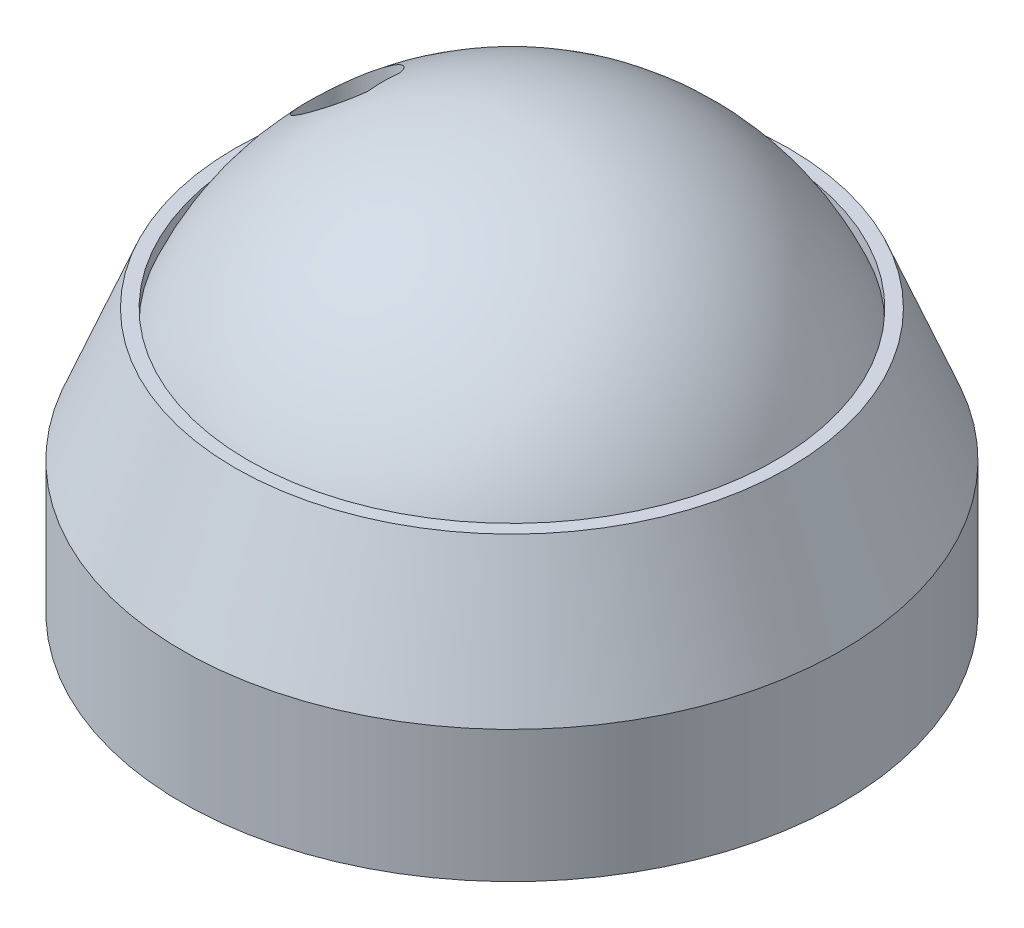
ISO-10303-21;
HEADER;
FILE_DESCRIPTION(('STEP AP214'),'2;1');
FILE_NAME('part.step','',(''),(''),'','','');
FILE_SCHEMA(('AUTOMOTIVE_DESIGN { 1 0 10303 214 1 1 1 1 }'));
ENDSEC;
DATA;
#1=APPLICATION_CONTEXT('core data for automotive mechanical design processes');
#2=APPLICATION_PROTOCOL_DEFINITION('international standard','automotive_design',2000,#1);
#3=PRODUCT_CONTEXT('',#1,'mechanical');
#4=PRODUCT('Part','Part','',(#3));
#5=PRODUCT_RELATED_PRODUCT_CATEGORY('part','',(#4));
#6=PRODUCT_DEFINITION_FORMATION('','',#4);
#7=PRODUCT_DEFINITION_CONTEXT('part definition',#1,'design');
#8=PRODUCT_DEFINITION('design','',#6,#7);
#9=PRODUCT_DEFINITION_SHAPE('','',#8);
#10=(LENGTH_UNIT() NAMED_UNIT(*) SI_UNIT(.MILLI.,.METRE.));
#11=(NAMED_UNIT(*) PLANE_ANGLE_UNIT() SI_UNIT($,.RADIAN.));
#12=(NAMED_UNIT(*) SI_UNIT($,.STERADIAN.) SOLID_ANGLE_UNIT());
#13=UNCERTAINTY_MEASURE_WITH_UNIT(LENGTH_MEASURE(1.E-05),#10,'distance_accuracy_value','');
#14=(GEOMETRIC_REPRESENTATION_CONTEXT(3) GLOBAL_UNCERTAINTY_ASSIGNED_CONTEXT((#13)) GLOBAL_UNIT_ASSIGNED_CONTEXT((#10,
#11,#12)) REPRESENTATION_CONTEXT('',''));
#15=CARTESIAN_POINT('',(0.,0.,0.));
#16=DIRECTION('',(0.,0.,1.));
#17=DIRECTION('',(1.,0.,0.));
#18=AXIS2_PLACEMENT_3D('',#15,#16,#17);
#19=CARTESIAN_POINT('',(18.9,18.,0.));
#20=DIRECTION('',(0.,1.,0.));
#21=DIRECTION('',(0.,0.,1.));
#22=AXIS2_PLACEMENT_3D('',#19,#20,#21);
#23=PLANE('',#22);
#24=CARTESIAN_POINT('',(0.,18.,0.));
#25=DIRECTION('',(0.,-1.,0.));
#26=DIRECTION('',(0.,0.,-1.));
#27=AXIS2_PLACEMENT_3D('',#24,#25,#26);
#28=CIRCLE('',#27,18.);
#29=CARTESIAN_POINT('',(0.,18.,-18.));
#30=VERTEX_POINT('',#29);
#31=EDGE_CURVE('E74',#30,#30,#28,.T.);
#32=ORIENTED_EDGE('',*,*,#31,.T.);
#33=EDGE_LOOP('',(#32));
#34=FACE_BOUND('',#33,.T.);
#35=CARTESIAN_POINT('',(0.,18.,0.));
#36=DIRECTION('',(0.,-1.,0.));
#37=DIRECTION('',(0.,0.,-1.));
#38=AXIS2_PLACEMENT_3D('',#35,#36,#37);
#39=CIRCLE('',#38,18.9);
#40=CARTESIAN_POINT('',(0.,18.,-18.9));
#41=VERTEX_POINT('',#40);
#42=EDGE_CURVE('E58',#41,#41,#39,.T.);
#43=ORIENTED_EDGE('',*,*,#42,.F.);
#44=EDGE_LOOP('',(#43));
#45=FACE_BOUND('',#44,.T.);
#46=ADVANCED_FACE('F35',(#34,#45),#23,.T.);
#47=CARTESIAN_POINT('',(0.,9.,0.));
#48=DIRECTION('',(0.,-1.,0.));
#49=DIRECTION('',(0.,0.,-1.));
#50=AXIS2_PLACEMENT_3D('',#47,#48,#49);
#51=CONICAL_SURFACE('',#50,22.5,0.380506377112365);
#52=ORIENTED_EDGE('',*,*,#42,.T.);
#53=EDGE_LOOP('',(#52));
#54=FACE_BOUND('',#53,.T.);
#55=CARTESIAN_POINT('',(0.,9.,0.));
#56=DIRECTION('',(0.,-1.,0.));
#57=DIRECTION('',(0.,0.,-1.));
#58=AXIS2_PLACEMENT_3D('',#55,#56,#57);
#59=CIRCLE('',#58,22.5);
#60=CARTESIAN_POINT('',(0.,9.,-22.5));
#61=VERTEX_POINT('',#60);
#62=EDGE_CURVE('E77',#61,#61,#59,.T.);
#63=ORIENTED_EDGE('',*,*,#62,.F.);
#64=EDGE_LOOP('',(#63));
#65=FACE_BOUND('',#64,.T.);
#66=ADVANCED_FACE('F89',(#54,#65),#51,.T.);
#67=CARTESIAN_POINT('',(0.,0.,0.));
#68=DIRECTION('',(0.,-1.,0.));
#69=DIRECTION('',(0.,0.,-1.));
#70=AXIS2_PLACEMENT_3D('',#67,#68,#69);
#71=CYLINDRICAL_SURFACE('',#70,22.5);
#72=ORIENTED_EDGE('',*,*,#62,.T.);
#73=EDGE_LOOP('',(#72));
#74=FACE_BOUND('',#73,.T.);
#75=CARTESIAN_POINT('',(0.,0.,0.));
#76=DIRECTION('',(0.,-1.,0.));
#77=DIRECTION('',(0.,0.,-1.));
#78=AXIS2_PLACEMENT_3D('',#75,#76,#77);
#79=CIRCLE('',#78,22.5);
#80=CARTESIAN_POINT('',(0.,0.,-22.5));
#81=VERTEX_POINT('',#80);
#82=EDGE_CURVE('E73',#81,#81,#79,.T.);
#83=ORIENTED_EDGE('',*,*,#82,.F.);
#84=EDGE_LOOP('',(#83));
#85=FACE_BOUND('',#84,.T.);
#86=ADVANCED_FACE('F97',(#74,#85),#71,.T.);
#87=CARTESIAN_POINT('',(0.,0.,0.));
#88=DIRECTION('',(0.,-1.,0.));
#89=DIRECTION('',(0.,0.,-1.));
#90=AXIS2_PLACEMENT_3D('',#87,#88,#89);
#91=PLANE('',#90);
#92=CARTESIAN_POINT('',(-11.25,0.,0.));
#93=DIRECTION('',(0.,-1.,0.));
#94=DIRECTION('',(0.,0.,-1.));
#95=AXIS2_PLACEMENT_3D('',#92,#93,#94);
#96=CIRCLE('',#95,2.75);
#97=CARTESIAN_POINT('',(-11.25,0.,-2.75));
#98=VERTEX_POINT('',#97);
#99=EDGE_CURVE('E62',#98,#98,#96,.T.);
#100=ORIENTED_EDGE('',*,*,#99,.F.);
#101=EDGE_LOOP('',(#100));
#102=FACE_BOUND('',#101,.T.);
#103=CARTESIAN_POINT('',(0.,0.,0.));
#104=DIRECTION('',(0.,-1.,0.));
#105=DIRECTION('',(0.,0.,-1.));
#106=AXIS2_PLACEMENT_3D('',#103,#104,#105);
#107=CIRCLE('',#106,7.5);
#108=CARTESIAN_POINT('',(0.,0.,-7.5));
#109=VERTEX_POINT('',#108);
#110=EDGE_CURVE('E61',#109,#109,#107,.T.);
#111=ORIENTED_EDGE('',*,*,#110,.F.);
#112=EDGE_LOOP('',(#111));
#113=FACE_BOUND('',#112,.T.);
#114=ORIENTED_EDGE('',*,*,#82,.T.);
#115=EDGE_LOOP('',(#114));
#116=FACE_BOUND('',#115,.T.);
#117=ADVANCED_FACE('F68',(#102,#113,#116),#91,.T.);
#118=CARTESIAN_POINT('',(0.,9.6,0.));
#119=DIRECTION('',(0.,-1.,0.));
#120=DIRECTION('',(1.,0.,0.));
#121=AXIS2_PLACEMENT_3D('',#118,#119,#120);
#122=SPHERICAL_SURFACE('',#121,19.5);
#123=CARTESIAN_POINT('',(0.,27.,0.));
#124=DIRECTION('',(0.,-1.,0.));
#125=DIRECTION('',(0.,0.,-1.));
#126=AXIS2_PLACEMENT_3D('',#123,#124,#125);
#127=CIRCLE('',#126,8.80284045067273);
#128=CARTESIAN_POINT('',(-8.73288888888889,27.,1.10754307109068));
#129=VERTEX_POINT('',#128);
#130=CARTESIAN_POINT('',(-8.73288888888889,27.,-1.10754307109068));
#131=VERTEX_POINT('',#130);
#132=EDGE_CURVE('E47',#129,#131,#127,.T.);
#133=ORIENTED_EDGE('',*,*,#132,.F.);
#134=CARTESIAN_POINT('',(-8.73257955377779,27.0002,1.1068397792555));
#135=CARTESIAN_POINT('',(-8.76391788933557,26.9799381352974,1.17814176952695));
#136=CARTESIAN_POINT('',(-8.7980938287284,26.9578067639889,1.24762807254513));
#137=CARTESIAN_POINT('',(-8.87155569184626,26.9101290208791,1.38252672908118));
#138=CARTESIAN_POINT('',(-8.91083680641327,26.8845858624167,1.44794283209683));
#139=CARTESIAN_POINT('',(-8.99374068683055,26.830541442223,1.57399233715092));
#140=CARTESIAN_POINT('',(-9.03733433863946,26.8020599677224,1.6346534394613));
#141=CARTESIAN_POINT('',(-9.12854102341587,26.7423079651934,1.75140084616624));
#142=CARTESIAN_POINT('',(-9.17615494623486,26.7110368196091,1.80748613231423));
#143=CARTESIAN_POINT('',(-9.32389012587105,26.6137195046671,1.96816794362367));
#144=CARTESIAN_POINT('',(-9.42928622671949,26.5439215615754,2.0657600174143));
#145=CARTESIAN_POINT('',(-9.65045167563703,26.3964369790129,2.24142089387375));
#146=CARTESIAN_POINT('',(-9.76623901702937,26.3187366235915,2.31945490837165));
#147=CARTESIAN_POINT('',(-10.0210670411998,26.1464304587477,2.46506498035052));
#148=CARTESIAN_POINT('',(-10.1611380407982,26.0509578209787,2.5298123291675));
#149=CARTESIAN_POINT('',(-10.4465583294342,25.8546023085069,2.63440948865674));
#150=CARTESIAN_POINT('',(-10.5919086214553,25.7537184039933,2.67425454182287));
#151=CARTESIAN_POINT('',(-10.9087041698076,25.531678529338,2.73424016840916));
#152=CARTESIAN_POINT('',(-11.0805328982617,25.4099034556128,2.75009771011336));
#153=CARTESIAN_POINT('',(-11.4228997322801,25.1643779175248,2.74990122457697));
#154=CARTESIAN_POINT('',(-11.5934364234544,25.0406256507415,2.73381621222164));
#155=CARTESIAN_POINT('',(-11.9465031021813,24.7813088969639,2.6670017496931));
#156=CARTESIAN_POINT('',(-12.1284698964381,24.6458343048985,2.6128891392895));
#157=CARTESIAN_POINT('',(-12.4806665620075,24.3801419501747,2.46663283131335));
#158=CARTESIAN_POINT('',(-12.6509033038747,24.2499211291144,2.37451162104811));
#159=CARTESIAN_POINT('',(-12.9372850306604,24.0281164596819,2.17686133705941));
#160=CARTESIAN_POINT('',(-13.0570220064678,23.9343965621463,2.07891519687718));
#161=CARTESIAN_POINT('',(-13.2817634638835,23.7569118310635,1.85983160032207));
#162=CARTESIAN_POINT('',(-13.3867902140755,23.6731319801657,1.73872986928816));
#163=CARTESIAN_POINT('',(-13.5580095331744,23.5355137627146,1.50084289317969));
#164=CARTESIAN_POINT('',(-13.6277600032047,23.4790469524005,1.38814058969232));
#165=CARTESIAN_POINT('',(-13.7518660104004,23.3780828591403,1.14942715053264));
#166=CARTESIAN_POINT('',(-13.8062283160637,23.3335803141357,1.02342189976312));
#167=CARTESIAN_POINT('',(-13.8739727191071,23.2779370969662,0.825952621953683));
#168=CARTESIAN_POINT('',(-13.8943198322123,23.2611865866784,0.758365472584077));
#169=CARTESIAN_POINT('',(-13.929905218396,23.2318504873902,0.620992211623225));
#170=CARTESIAN_POINT('',(-13.9451462095363,23.2192626825684,0.551207291650276));
#171=CARTESIAN_POINT('',(-13.9702002195346,23.1985515333095,0.410053888627027));
#172=CARTESIAN_POINT('',(-13.9800163528954,23.1904256272381,0.338686338723882));
#173=CARTESIAN_POINT('',(-13.9940243835932,23.1788247647602,0.195053309711535));
#174=CARTESIAN_POINT('',(-13.9982171711417,23.1753490721955,0.122787974555999));
#175=CARTESIAN_POINT('',(-14.0018045491318,23.1723771856151,-0.0738011199813708));
#176=CARTESIAN_POINT('',(-13.9956186403559,23.177508442898,-0.198372713082546));
#177=CARTESIAN_POINT('',(-13.9667230955312,23.2014286595542,-0.444140135010598));
#178=CARTESIAN_POINT('',(-13.9440136904118,23.2202174280524,-0.565336010991336));
#179=CARTESIAN_POINT('',(-13.8842823271563,23.2694634065704,-0.798214730988902));
#180=CARTESIAN_POINT('',(-13.8476352608744,23.2996148082598,-0.910060293814126));
#181=CARTESIAN_POINT('',(-13.761833882313,23.3698935339124,-1.12545563237906));
#182=CARTESIAN_POINT('',(-13.7126759569077,23.4100237396689,-1.22900300022842));
#183=CARTESIAN_POINT('',(-13.5966866524044,23.5042093035423,-1.43937590700242));
#184=CARTESIAN_POINT('',(-13.5283890583273,23.5593963276835,-1.54488038396116));
#185=CARTESIAN_POINT('',(-13.3808068172434,23.6778322373306,-1.74282272916426));
#186=CARTESIAN_POINT('',(-13.301515418485,23.7410860750723,-1.83525249667158));
#187=CARTESIAN_POINT('',(-13.1164609363559,23.887618629102,-2.02481168991637));
#188=CARTESIAN_POINT('',(-13.008638675208,23.9723100851763,-2.11883634245211));
#189=CARTESIAN_POINT('',(-12.7831341584558,24.1477560028457,-2.28732203519445));
#190=CARTESIAN_POINT('',(-12.6654450685257,24.2385146579615,-2.36176936489789));
#191=CARTESIAN_POINT('',(-12.3965420312939,24.443869317419,-2.50516939729481));
#192=CARTESIAN_POINT('',(-12.2435611752357,24.5593943595598,-2.569497764657));
#193=CARTESIAN_POINT('',(-11.9304085631966,24.793074226606,-2.66956945704755));
#194=CARTESIAN_POINT('',(-11.7702321950596,24.9112307130204,-2.70529416352612));
#195=CARTESIAN_POINT('',(-11.4235907339013,25.1639733261773,-2.75081380407571));
#196=CARTESIAN_POINT('',(-11.2365539613876,25.2985713674322,-2.75633860204685));
#197=CARTESIAN_POINT('',(-10.8626167311964,25.5642983540246,-2.72903612838612));
#198=CARTESIAN_POINT('',(-10.6757164555657,25.6954248514255,-2.69618249429114));
#199=CARTESIAN_POINT('',(-10.3071601110505,25.9510010582586,-2.59043611560896));
#200=CARTESIAN_POINT('',(-10.1255277769887,26.0754222290386,-2.51738511327865));
#201=CARTESIAN_POINT('',(-9.8637572107781,26.2528978151231,-2.37710927662119));
#202=CARTESIAN_POINT('',(-9.77828614722577,26.3105262531666,-2.32523925569251));
#203=CARTESIAN_POINT('',(-9.61196581798665,26.4221244261251,-2.21122050622008));
#204=CARTESIAN_POINT('',(-9.53111421647299,26.4760960127367,-2.14907703545256));
#205=CARTESIAN_POINT('',(-9.34575049172566,26.5992854524123,-1.98908767912911));
#206=CARTESIAN_POINT('',(-9.24385823132107,26.6665471188986,-1.88662894535645));
#207=CARTESIAN_POINT('',(-9.05524153847734,26.7904304236257,-1.66336228908146));
#208=CARTESIAN_POINT('',(-8.96847304424797,26.8470830076463,-1.54260965305638));
#209=CARTESIAN_POINT('',(-8.86192953078579,26.9163781375861,-1.36487723259077));
#210=CARTESIAN_POINT('',(-8.83397551644834,26.9345276178659,-1.31478226295641));
#211=CARTESIAN_POINT('',(-8.78101780241953,26.9688627163075,-1.21241177914529));
#212=CARTESIAN_POINT('',(-8.75601398266068,26.9850484143924,-1.16013635382634));
#213=CARTESIAN_POINT('',(-8.73257955377778,27.0002,-1.10683977925547));
#214=B_SPLINE_CURVE_WITH_KNOTS('',3,(#134,#135,#136,#137,#138,#139,#140,#141,#142,#143,#144,
#145,#146,#147,#148,#149,#150,#151,#152,#153,#154,#155,#156,#157,#158,#159,#160,#161,#162,#163,
#164,#165,#166,#167,#168,#169,#170,#171,#172,#173,#174,#175,#176,#177,#178,#179,#180,#181,#182,
#183,#184,#185,#186,#187,#188,#189,#190,#191,#192,#193,#194,#195,#196,#197,#198,#199,#200,#201,
#202,#203,#204,#205,#206,#207,#208,#209,#210,#211,#212,#213),.UNSPECIFIED.,.F.,.F.,(4,2,2,2,2,2,
2,2,2,2,2,2,2,2,2,2,2,2,2,2,2,2,2,2,2,2,2,2,2,2,2,2,2,2,2,2,2,2,2,4),(0.,0.241291974419717,
0.482358273444238,0.721895761647538,0.961486409048212,1.43850678093392,1.91636970784866,
2.45866398408384,3.00106183230895,3.63207877644221,4.26370812254603,4.96010161165017,
5.65608367781853,6.19671001567553,6.73650888815692,7.16710592641405,7.59751327082956,
7.81486685332668,8.03210455088864,8.24921739869646,8.46629587209656,8.83871273868013,
9.21112440052974,9.57415624848944,9.93729305896017,10.3475957617852,10.7581515739658,
11.2551109643752,11.7524174669174,12.3566669114854,12.9613093520106,13.6495864381382,
14.3383365856455,15.0298179593979,15.3755057099983,15.7210170881111,16.1972344400309,
16.6720403000098,16.8524296915586,17.0328117390573),.UNSPECIFIED.);
#215=EDGE_CURVE('E11',#129,#131,#214,.T.);
#216=ORIENTED_EDGE('',*,*,#215,.T.);
#217=EDGE_LOOP('',(#133,#216));
#218=FACE_BOUND('',#217,.T.);
#219=CARTESIAN_POINT('',(0.,17.1,0.));
#220=DIRECTION('',(0.,-1.,0.));
#221=DIRECTION('',(0.,0.,-1.));
#222=AXIS2_PLACEMENT_3D('',#219,#220,#221);
#223=CIRCLE('',#222,18.);
#224=CARTESIAN_POINT('',(0.,17.1,-18.));
#225=VERTEX_POINT('',#224);
#226=EDGE_CURVE('E71',#225,#225,#223,.T.);
#227=ORIENTED_EDGE('',*,*,#226,.F.);
#228=EDGE_LOOP('',(#227));
#229=FACE_BOUND('',#228,.T.);
#230=ADVANCED_FACE('F64',(#218,#229),#122,.T.);
#231=CARTESIAN_POINT('',(0.,0.,0.));
#232=DIRECTION('',(0.,-1.,0.));
#233=DIRECTION('',(0.,0.,-1.));
#234=AXIS2_PLACEMENT_3D('',#231,#232,#233);
#235=CYLINDRICAL_SURFACE('',#234,18.);
#236=ORIENTED_EDGE('',*,*,#226,.T.);
#237=EDGE_LOOP('',(#236));
#238=FACE_BOUND('',#237,.T.);
#239=ORIENTED_EDGE('',*,*,#31,.F.);
#240=EDGE_LOOP('',(#239));
#241=FACE_BOUND('',#240,.T.);
#242=ADVANCED_FACE('F67',(#238,#241),#235,.F.);
#243=CARTESIAN_POINT('',(0.,-10.,0.));
#244=DIRECTION('',(0.,1.,0.));
#245=DIRECTION('',(0.,0.,1.));
#246=AXIS2_PLACEMENT_3D('',#243,#244,#245);
#247=CYLINDRICAL_SURFACE('',#246,7.5);
#248=CARTESIAN_POINT('',(0.,-10.,0.));
#249=DIRECTION('',(0.,-1.,0.));
#250=DIRECTION('',(0.,0.,-1.));
#251=AXIS2_PLACEMENT_3D('',#248,#249,#250);
#252=CIRCLE('',#251,7.5);
#253=CARTESIAN_POINT('',(0.,-10.,-7.5));
#254=VERTEX_POINT('',#253);
#255=EDGE_CURVE('E80',#254,#254,#252,.T.);
#256=ORIENTED_EDGE('',*,*,#255,.F.);
#257=EDGE_LOOP('',(#256));
#258=FACE_BOUND('',#257,.T.);
#259=ORIENTED_EDGE('',*,*,#110,.T.);
#260=EDGE_LOOP('',(#259));
#261=FACE_BOUND('',#260,.T.);
#262=ADVANCED_FACE('F101',(#258,#261),#247,.T.);
#263=CARTESIAN_POINT('',(0.,-10.,0.));
#264=DIRECTION('',(0.,-1.,0.));
#265=DIRECTION('',(0.,0.,-1.));
#266=AXIS2_PLACEMENT_3D('',#263,#264,#265);
#267=PLANE('',#266);
#268=ORIENTED_EDGE('',*,*,#255,.T.);
#269=EDGE_LOOP('',(#268));
#270=FACE_BOUND('',#269,.T.);
#271=ADVANCED_FACE('F107',(#270),#267,.T.);
#272=CARTESIAN_POINT('',(-11.25,27.,0.));
#273=DIRECTION('',(0.,-1.,0.));
#274=DIRECTION('',(0.,0.,-1.));
#275=AXIS2_PLACEMENT_3D('',#272,#273,#274);
#276=CYLINDRICAL_SURFACE('',#275,2.75);
#277=ORIENTED_EDGE('',*,*,#99,.T.);
#278=EDGE_LOOP('',(#277));
#279=FACE_BOUND('',#278,.T.);
#280=CARTESIAN_POINT('',(-11.25,27.,0.));
#281=DIRECTION('',(0.,-1.,0.));
#282=DIRECTION('',(0.,0.,-1.));
#283=AXIS2_PLACEMENT_3D('',#280,#281,#282);
#284=CIRCLE('',#283,2.75);
#285=EDGE_CURVE('E53',#131,#129,#284,.T.);
#286=ORIENTED_EDGE('',*,*,#285,.F.);
#287=ORIENTED_EDGE('',*,*,#215,.F.);
#288=EDGE_LOOP('',(#286,#287));
#289=FACE_BOUND('',#288,.T.);
#290=ADVANCED_FACE('F60',(#279,#289),#276,.F.);
#291=CARTESIAN_POINT('',(-11.25,27.,0.));
#292=DIRECTION('',(0.,-1.,0.));
#293=DIRECTION('',(0.,0.,-1.));
#294=AXIS2_PLACEMENT_3D('',#291,#292,#293);
#295=PLANE('',#294);
#296=ORIENTED_EDGE('',*,*,#132,.T.);
#297=ORIENTED_EDGE('',*,*,#285,.T.);
#298=EDGE_LOOP('',(#296,#297));
#299=FACE_BOUND('',#298,.T.);
#300=ADVANCED_FACE('F56',(#299),#295,.T.);
#301=CLOSED_SHELL('',(#46,#66,#86,#117,#230,#242,#262,#271,#290,#300));
#302=MANIFOLD_SOLID_BREP('B2',#301);
#303=ADVANCED_BREP_SHAPE_REPRESENTATION('',(#18,#302),#14);
#304=SHAPE_DEFINITION_REPRESENTATION(#9,#303);
ENDSEC;
END-ISO-10303-21;
